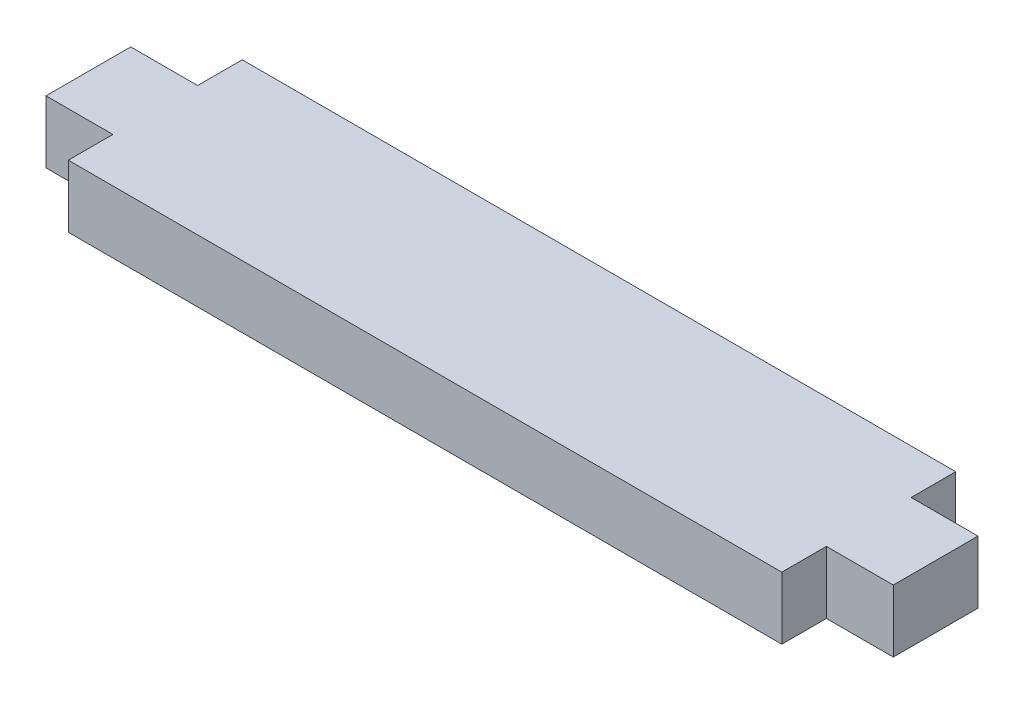
ISO-10303-21;
HEADER;
FILE_DESCRIPTION(('STEP AP214'),'2;1');
FILE_NAME('part.step','',(''),(''),'','','');
FILE_SCHEMA(('AUTOMOTIVE_DESIGN { 1 0 10303 214 1 1 1 1 }'));
ENDSEC;
DATA;
#1=APPLICATION_CONTEXT('core data for automotive mechanical design processes');
#2=APPLICATION_PROTOCOL_DEFINITION('international standard','automotive_design',2000,#1);
#3=PRODUCT_CONTEXT('',#1,'mechanical');
#4=PRODUCT('Part','Part','',(#3));
#5=PRODUCT_RELATED_PRODUCT_CATEGORY('part','',(#4));
#6=PRODUCT_DEFINITION_FORMATION('','',#4);
#7=PRODUCT_DEFINITION_CONTEXT('part definition',#1,'design');
#8=PRODUCT_DEFINITION('design','',#6,#7);
#9=PRODUCT_DEFINITION_SHAPE('','',#8);
#10=(LENGTH_UNIT() NAMED_UNIT(*) SI_UNIT(.MILLI.,.METRE.));
#11=(NAMED_UNIT(*) PLANE_ANGLE_UNIT() SI_UNIT($,.RADIAN.));
#12=(NAMED_UNIT(*) SI_UNIT($,.STERADIAN.) SOLID_ANGLE_UNIT());
#13=UNCERTAINTY_MEASURE_WITH_UNIT(LENGTH_MEASURE(1.E-05),#10,'distance_accuracy_value','');
#14=(GEOMETRIC_REPRESENTATION_CONTEXT(3) GLOBAL_UNCERTAINTY_ASSIGNED_CONTEXT((#13)) GLOBAL_UNIT_ASSIGNED_CONTEXT((#10,
#11,#12)) REPRESENTATION_CONTEXT('',''));
#15=CARTESIAN_POINT('',(0.,0.,0.));
#16=DIRECTION('',(0.,0.,1.));
#17=DIRECTION('',(1.,0.,0.));
#18=AXIS2_PLACEMENT_3D('',#15,#16,#17);
#19=CARTESIAN_POINT('',(80.,0.,19.5));
#20=DIRECTION('',(-1.,0.,0.));
#21=DIRECTION('',(0.,0.,1.));
#22=AXIS2_PLACEMENT_3D('',#19,#20,#21);
#23=PLANE('',#22);
#24=DIRECTION('',(0.,1.,0.));
#25=VECTOR('',#24,1.);
#26=CARTESIAN_POINT('',(80.,-7.,5.));
#27=LINE('',#26,#25);
#28=CARTESIAN_POINT('',(80.,-7.,5.));
#29=VERTEX_POINT('',#28);
#30=CARTESIAN_POINT('',(80.,0.,5.));
#31=VERTEX_POINT('',#30);
#32=EDGE_CURVE('E132',#29,#31,#27,.T.);
#33=ORIENTED_EDGE('',*,*,#32,.F.);
#34=DIRECTION('',(0.,0.,-1.));
#35=VECTOR('',#34,1.);
#36=CARTESIAN_POINT('',(80.,-7.,19.5));
#37=LINE('',#36,#35);
#38=CARTESIAN_POINT('',(80.,-7.,0.));
#39=VERTEX_POINT('',#38);
#40=EDGE_CURVE('E146',#29,#39,#37,.T.);
#41=ORIENTED_EDGE('',*,*,#40,.T.);
#42=DIRECTION('',(0.,1.,0.));
#43=VECTOR('',#42,1.);
#44=CARTESIAN_POINT('',(80.,0.,0.));
#45=LINE('',#44,#43);
#46=CARTESIAN_POINT('',(80.,0.,0.));
#47=VERTEX_POINT('',#46);
#48=EDGE_CURVE('E176',#39,#47,#45,.T.);
#49=ORIENTED_EDGE('',*,*,#48,.T.);
#50=DIRECTION('',(0.,0.,-1.));
#51=VECTOR('',#50,1.);
#52=CARTESIAN_POINT('',(80.,0.,19.5));
#53=LINE('',#52,#51);
#54=EDGE_CURVE('E148',#31,#47,#53,.T.);
#55=ORIENTED_EDGE('',*,*,#54,.F.);
#56=EDGE_LOOP('',(#33,#41,#49,#55));
#57=FACE_BOUND('',#56,.T.);
#58=ADVANCED_FACE('F39',(#57),#23,.F.);
#59=CARTESIAN_POINT('',(0.,0.,19.5));
#60=DIRECTION('',(1.,0.,0.));
#61=DIRECTION('',(0.,1.,0.));
#62=AXIS2_PLACEMENT_3D('',#59,#60,#61);
#63=PLANE('',#62);
#64=DIRECTION('',(0.,1.,0.));
#65=VECTOR('',#64,1.);
#66=CARTESIAN_POINT('',(0.,-7.,14.5));
#67=LINE('',#66,#65);
#68=CARTESIAN_POINT('',(0.,-7.,14.5));
#69=VERTEX_POINT('',#68);
#70=CARTESIAN_POINT('',(0.,0.,14.5));
#71=VERTEX_POINT('',#70);
#72=EDGE_CURVE('E185',#69,#71,#67,.T.);
#73=ORIENTED_EDGE('',*,*,#72,.F.);
#74=DIRECTION('',(0.,0.,-1.));
#75=VECTOR('',#74,1.);
#76=CARTESIAN_POINT('',(0.,-7.,19.5));
#77=LINE('',#76,#75);
#78=CARTESIAN_POINT('',(0.,-7.,19.5));
#79=VERTEX_POINT('',#78);
#80=EDGE_CURVE('E11',#79,#69,#77,.T.);
#81=ORIENTED_EDGE('',*,*,#80,.F.);
#82=DIRECTION('',(0.,-1.,0.));
#83=VECTOR('',#82,1.);
#84=CARTESIAN_POINT('',(0.,0.,19.5));
#85=LINE('',#84,#83);
#86=CARTESIAN_POINT('',(0.,0.,19.5));
#87=VERTEX_POINT('',#86);
#88=EDGE_CURVE('E175',#87,#79,#85,.T.);
#89=ORIENTED_EDGE('',*,*,#88,.F.);
#90=DIRECTION('',(0.,0.,-1.));
#91=VECTOR('',#90,1.);
#92=CARTESIAN_POINT('',(0.,0.,19.5));
#93=LINE('',#92,#91);
#94=EDGE_CURVE('E166',#87,#71,#93,.T.);
#95=ORIENTED_EDGE('',*,*,#94,.T.);
#96=EDGE_LOOP('',(#73,#81,#89,#95));
#97=FACE_BOUND('',#96,.T.);
#98=ADVANCED_FACE('F270',(#97),#63,.F.);
#99=CARTESIAN_POINT('',(0.,-7.,5.));
#100=VERTEX_POINT('',#99);
#101=CARTESIAN_POINT('',(0.,-7.,0.));
#102=VERTEX_POINT('',#101);
#103=EDGE_CURVE('E48',#100,#102,#77,.T.);
#104=ORIENTED_EDGE('',*,*,#103,.F.);
#105=DIRECTION('',(0.,1.,0.));
#106=VECTOR('',#105,1.);
#107=CARTESIAN_POINT('',(0.,-7.,5.));
#108=LINE('',#107,#106);
#109=CARTESIAN_POINT('',(0.,0.,5.));
#110=VERTEX_POINT('',#109);
#111=EDGE_CURVE('E198',#100,#110,#108,.T.);
#112=ORIENTED_EDGE('',*,*,#111,.T.);
#113=CARTESIAN_POINT('',(0.,0.,0.));
#114=VERTEX_POINT('',#113);
#115=EDGE_CURVE('E170',#110,#114,#93,.T.);
#116=ORIENTED_EDGE('',*,*,#115,.T.);
#117=DIRECTION('',(0.,-1.,0.));
#118=VECTOR('',#117,1.);
#119=CARTESIAN_POINT('',(0.,0.,0.));
#120=LINE('',#119,#118);
#121=EDGE_CURVE('E181',#114,#102,#120,.T.);
#122=ORIENTED_EDGE('',*,*,#121,.T.);
#123=EDGE_LOOP('',(#104,#112,#116,#122));
#124=FACE_BOUND('',#123,.T.);
#125=ADVANCED_FACE('F41',(#124),#63,.F.);
#126=CARTESIAN_POINT('',(0.,-7.,19.5));
#127=DIRECTION('',(0.,1.,0.));
#128=DIRECTION('',(0.,0.,1.));
#129=AXIS2_PLACEMENT_3D('',#126,#127,#128);
#130=PLANE('',#129);
#131=DIRECTION('',(1.,0.,0.));
#132=VECTOR('',#131,1.);
#133=CARTESIAN_POINT('',(0.,-7.,0.));
#134=LINE('',#133,#132);
#135=EDGE_CURVE('E155',#102,#39,#134,.T.);
#136=ORIENTED_EDGE('',*,*,#135,.T.);
#137=ORIENTED_EDGE('',*,*,#40,.F.);
#138=DIRECTION('',(-1.,0.,0.));
#139=VECTOR('',#138,1.);
#140=CARTESIAN_POINT('',(80.,-7.,5.));
#141=LINE('',#140,#139);
#142=CARTESIAN_POINT('',(87.5,-7.,5.));
#143=VERTEX_POINT('',#142);
#144=EDGE_CURVE('E128',#143,#29,#141,.T.);
#145=ORIENTED_EDGE('',*,*,#144,.F.);
#146=DIRECTION('',(0.,0.,-1.));
#147=VECTOR('',#146,1.);
#148=CARTESIAN_POINT('',(87.5,-7.,5.));
#149=LINE('',#148,#147);
#150=CARTESIAN_POINT('',(87.5,-7.,14.5));
#151=VERTEX_POINT('',#150);
#152=EDGE_CURVE('E151',#151,#143,#149,.T.);
#153=ORIENTED_EDGE('',*,*,#152,.F.);
#154=DIRECTION('',(1.,0.,0.));
#155=VECTOR('',#154,1.);
#156=CARTESIAN_POINT('',(80.,-7.,14.5));
#157=LINE('',#156,#155);
#158=CARTESIAN_POINT('',(80.,-7.,14.5));
#159=VERTEX_POINT('',#158);
#160=EDGE_CURVE('E140',#159,#151,#157,.T.);
#161=ORIENTED_EDGE('',*,*,#160,.F.);
#162=CARTESIAN_POINT('',(80.,-7.,19.5));
#163=VERTEX_POINT('',#162);
#164=EDGE_CURVE('E158',#163,#159,#37,.T.);
#165=ORIENTED_EDGE('',*,*,#164,.F.);
#166=DIRECTION('',(1.,0.,0.));
#167=VECTOR('',#166,1.);
#168=CARTESIAN_POINT('',(0.,-7.,19.5));
#169=LINE('',#168,#167);
#170=EDGE_CURVE('E192',#79,#163,#169,.T.);
#171=ORIENTED_EDGE('',*,*,#170,.F.);
#172=ORIENTED_EDGE('',*,*,#80,.T.);
#173=DIRECTION('',(1.,0.,0.));
#174=VECTOR('',#173,1.);
#175=CARTESIAN_POINT('',(0.,-7.,14.5));
#176=LINE('',#175,#174);
#177=CARTESIAN_POINT('',(-7.5,-7.,14.5));
#178=VERTEX_POINT('',#177);
#179=EDGE_CURVE('E202',#178,#69,#176,.T.);
#180=ORIENTED_EDGE('',*,*,#179,.F.);
#181=DIRECTION('',(0.,0.,1.));
#182=VECTOR('',#181,1.);
#183=CARTESIAN_POINT('',(-7.5,-7.,5.));
#184=LINE('',#183,#182);
#185=CARTESIAN_POINT('',(-7.5,-7.,5.));
#186=VERTEX_POINT('',#185);
#187=EDGE_CURVE('E223',#186,#178,#184,.T.);
#188=ORIENTED_EDGE('',*,*,#187,.F.);
#189=DIRECTION('',(-1.,0.,0.));
#190=VECTOR('',#189,1.);
#191=CARTESIAN_POINT('',(0.,-7.,5.));
#192=LINE('',#191,#190);
#193=EDGE_CURVE('E214',#100,#186,#192,.T.);
#194=ORIENTED_EDGE('',*,*,#193,.F.);
#195=ORIENTED_EDGE('',*,*,#103,.T.);
#196=EDGE_LOOP('',(#136,#137,#145,#153,#161,#165,#171,#172,#180,#188,#194,#195));
#197=FACE_BOUND('',#196,.T.);
#198=ADVANCED_FACE('F153',(#197),#130,.F.);
#199=ORIENTED_EDGE('',*,*,#164,.T.);
#200=DIRECTION('',(0.,1.,0.));
#201=VECTOR('',#200,1.);
#202=CARTESIAN_POINT('',(80.,-7.,14.5));
#203=LINE('',#202,#201);
#204=CARTESIAN_POINT('',(80.,0.,14.5));
#205=VERTEX_POINT('',#204);
#206=EDGE_CURVE('E150',#159,#205,#203,.T.);
#207=ORIENTED_EDGE('',*,*,#206,.T.);
#208=CARTESIAN_POINT('',(80.,0.,19.5));
#209=VERTEX_POINT('',#208);
#210=EDGE_CURVE('E159',#209,#205,#53,.T.);
#211=ORIENTED_EDGE('',*,*,#210,.F.);
#212=DIRECTION('',(0.,1.,0.));
#213=VECTOR('',#212,1.);
#214=CARTESIAN_POINT('',(80.,0.,19.5));
#215=LINE('',#214,#213);
#216=EDGE_CURVE('E189',#163,#209,#215,.T.);
#217=ORIENTED_EDGE('',*,*,#216,.F.);
#218=EDGE_LOOP('',(#199,#207,#211,#217));
#219=FACE_BOUND('',#218,.T.);
#220=ADVANCED_FACE('F262',(#219),#23,.F.);
#221=CARTESIAN_POINT('',(0.,0.,19.5));
#222=DIRECTION('',(0.,-1.,0.));
#223=DIRECTION('',(0.,0.,-1.));
#224=AXIS2_PLACEMENT_3D('',#221,#222,#223);
#225=PLANE('',#224);
#226=DIRECTION('',(-1.,0.,0.));
#227=VECTOR('',#226,1.);
#228=CARTESIAN_POINT('',(0.,0.,0.));
#229=LINE('',#228,#227);
#230=EDGE_CURVE('E171',#47,#114,#229,.T.);
#231=ORIENTED_EDGE('',*,*,#230,.T.);
#232=ORIENTED_EDGE('',*,*,#115,.F.);
#233=DIRECTION('',(-1.,0.,0.));
#234=VECTOR('',#233,1.);
#235=CARTESIAN_POINT('',(0.,0.,5.));
#236=LINE('',#235,#234);
#237=CARTESIAN_POINT('',(-7.5,0.,5.));
#238=VERTEX_POINT('',#237);
#239=EDGE_CURVE('E63',#110,#238,#236,.T.);
#240=ORIENTED_EDGE('',*,*,#239,.T.);
#241=DIRECTION('',(0.,0.,1.));
#242=VECTOR('',#241,1.);
#243=CARTESIAN_POINT('',(-7.5,0.,5.));
#244=LINE('',#243,#242);
#245=CARTESIAN_POINT('',(-7.5,0.,14.5));
#246=VERTEX_POINT('',#245);
#247=EDGE_CURVE('E215',#238,#246,#244,.T.);
#248=ORIENTED_EDGE('',*,*,#247,.T.);
#249=DIRECTION('',(1.,0.,0.));
#250=VECTOR('',#249,1.);
#251=CARTESIAN_POINT('',(0.,0.,14.5));
#252=LINE('',#251,#250);
#253=EDGE_CURVE('E210',#246,#71,#252,.T.);
#254=ORIENTED_EDGE('',*,*,#253,.T.);
#255=ORIENTED_EDGE('',*,*,#94,.F.);
#256=DIRECTION('',(-1.,0.,0.));
#257=VECTOR('',#256,1.);
#258=CARTESIAN_POINT('',(0.,0.,19.5));
#259=LINE('',#258,#257);
#260=EDGE_CURVE('E186',#209,#87,#259,.T.);
#261=ORIENTED_EDGE('',*,*,#260,.F.);
#262=ORIENTED_EDGE('',*,*,#210,.T.);
#263=DIRECTION('',(1.,0.,0.));
#264=VECTOR('',#263,1.);
#265=CARTESIAN_POINT('',(80.,0.,14.5));
#266=LINE('',#265,#264);
#267=CARTESIAN_POINT('',(87.5,0.,14.5));
#268=VERTEX_POINT('',#267);
#269=EDGE_CURVE('E55',#205,#268,#266,.T.);
#270=ORIENTED_EDGE('',*,*,#269,.T.);
#271=DIRECTION('',(0.,0.,-1.));
#272=VECTOR('',#271,1.);
#273=CARTESIAN_POINT('',(87.5,0.,5.));
#274=LINE('',#273,#272);
#275=CARTESIAN_POINT('',(87.5,0.,5.));
#276=VERTEX_POINT('',#275);
#277=EDGE_CURVE('E141',#268,#276,#274,.T.);
#278=ORIENTED_EDGE('',*,*,#277,.T.);
#279=DIRECTION('',(-1.,0.,0.));
#280=VECTOR('',#279,1.);
#281=CARTESIAN_POINT('',(80.,0.,5.));
#282=LINE('',#281,#280);
#283=EDGE_CURVE('E242',#276,#31,#282,.T.);
#284=ORIENTED_EDGE('',*,*,#283,.T.);
#285=ORIENTED_EDGE('',*,*,#54,.T.);
#286=EDGE_LOOP('',(#231,#232,#240,#248,#254,#255,#261,#262,#270,#278,#284,#285));
#287=FACE_BOUND('',#286,.T.);
#288=ADVANCED_FACE('F256',(#287),#225,.F.);
#289=CARTESIAN_POINT('',(0.,0.,19.5));
#290=DIRECTION('',(0.,0.,1.));
#291=DIRECTION('',(1.,0.,0.));
#292=AXIS2_PLACEMENT_3D('',#289,#290,#291);
#293=PLANE('',#292);
#294=ORIENTED_EDGE('',*,*,#88,.T.);
#295=ORIENTED_EDGE('',*,*,#170,.T.);
#296=ORIENTED_EDGE('',*,*,#216,.T.);
#297=ORIENTED_EDGE('',*,*,#260,.T.);
#298=EDGE_LOOP('',(#294,#295,#296,#297));
#299=FACE_BOUND('',#298,.T.);
#300=ADVANCED_FACE('F267',(#299),#293,.T.);
#301=CARTESIAN_POINT('',(0.,0.,0.));
#302=DIRECTION('',(0.,0.,1.));
#303=DIRECTION('',(1.,0.,0.));
#304=AXIS2_PLACEMENT_3D('',#301,#302,#303);
#305=PLANE('',#304);
#306=ORIENTED_EDGE('',*,*,#121,.F.);
#307=ORIENTED_EDGE('',*,*,#230,.F.);
#308=ORIENTED_EDGE('',*,*,#48,.F.);
#309=ORIENTED_EDGE('',*,*,#135,.F.);
#310=EDGE_LOOP('',(#306,#307,#308,#309));
#311=FACE_BOUND('',#310,.T.);
#312=ADVANCED_FACE('F288',(#311),#305,.F.);
#313=CARTESIAN_POINT('',(0.,-7.,14.5));
#314=DIRECTION('',(0.,0.,1.));
#315=DIRECTION('',(1.,0.,0.));
#316=AXIS2_PLACEMENT_3D('',#313,#314,#315);
#317=PLANE('',#316);
#318=ORIENTED_EDGE('',*,*,#253,.F.);
#319=DIRECTION('',(0.,1.,0.));
#320=VECTOR('',#319,1.);
#321=CARTESIAN_POINT('',(-7.5,-7.,14.5));
#322=LINE('',#321,#320);
#323=EDGE_CURVE('E205',#178,#246,#322,.T.);
#324=ORIENTED_EDGE('',*,*,#323,.F.);
#325=ORIENTED_EDGE('',*,*,#179,.T.);
#326=ORIENTED_EDGE('',*,*,#72,.T.);
#327=EDGE_LOOP('',(#318,#324,#325,#326));
#328=FACE_BOUND('',#327,.T.);
#329=ADVANCED_FACE('F273',(#328),#317,.T.);
#330=CARTESIAN_POINT('',(-7.5,-7.,5.));
#331=DIRECTION('',(-1.,0.,0.));
#332=DIRECTION('',(0.,0.,1.));
#333=AXIS2_PLACEMENT_3D('',#330,#331,#332);
#334=PLANE('',#333);
#335=ORIENTED_EDGE('',*,*,#247,.F.);
#336=DIRECTION('',(0.,1.,0.));
#337=VECTOR('',#336,1.);
#338=CARTESIAN_POINT('',(-7.5,-7.,5.));
#339=LINE('',#338,#337);
#340=EDGE_CURVE('E201',#186,#238,#339,.T.);
#341=ORIENTED_EDGE('',*,*,#340,.F.);
#342=ORIENTED_EDGE('',*,*,#187,.T.);
#343=ORIENTED_EDGE('',*,*,#323,.T.);
#344=EDGE_LOOP('',(#335,#341,#342,#343));
#345=FACE_BOUND('',#344,.T.);
#346=ADVANCED_FACE('F277',(#345),#334,.T.);
#347=CARTESIAN_POINT('',(0.,-7.,5.));
#348=DIRECTION('',(0.,0.,-1.));
#349=DIRECTION('',(-1.,0.,0.));
#350=AXIS2_PLACEMENT_3D('',#347,#348,#349);
#351=PLANE('',#350);
#352=ORIENTED_EDGE('',*,*,#239,.F.);
#353=ORIENTED_EDGE('',*,*,#111,.F.);
#354=ORIENTED_EDGE('',*,*,#193,.T.);
#355=ORIENTED_EDGE('',*,*,#340,.T.);
#356=EDGE_LOOP('',(#352,#353,#354,#355));
#357=FACE_BOUND('',#356,.T.);
#358=ADVANCED_FACE('F281',(#357),#351,.T.);
#359=CARTESIAN_POINT('',(80.,-7.,5.));
#360=DIRECTION('',(0.,0.,-1.));
#361=DIRECTION('',(-1.,0.,0.));
#362=AXIS2_PLACEMENT_3D('',#359,#360,#361);
#363=PLANE('',#362);
#364=ORIENTED_EDGE('',*,*,#283,.F.);
#365=DIRECTION('',(0.,1.,0.));
#366=VECTOR('',#365,1.);
#367=CARTESIAN_POINT('',(87.5,-7.,5.));
#368=LINE('',#367,#366);
#369=EDGE_CURVE('E134',#143,#276,#368,.T.);
#370=ORIENTED_EDGE('',*,*,#369,.F.);
#371=ORIENTED_EDGE('',*,*,#144,.T.);
#372=ORIENTED_EDGE('',*,*,#32,.T.);
#373=EDGE_LOOP('',(#364,#370,#371,#372));
#374=FACE_BOUND('',#373,.T.);
#375=ADVANCED_FACE('F131',(#374),#363,.T.);
#376=CARTESIAN_POINT('',(87.5,-7.,5.));
#377=DIRECTION('',(1.,0.,0.));
#378=DIRECTION('',(0.,0.,-1.));
#379=AXIS2_PLACEMENT_3D('',#376,#377,#378);
#380=PLANE('',#379);
#381=ORIENTED_EDGE('',*,*,#277,.F.);
#382=DIRECTION('',(0.,1.,0.));
#383=VECTOR('',#382,1.);
#384=CARTESIAN_POINT('',(87.5,-7.,14.5));
#385=LINE('',#384,#383);
#386=EDGE_CURVE('E232',#151,#268,#385,.T.);
#387=ORIENTED_EDGE('',*,*,#386,.F.);
#388=ORIENTED_EDGE('',*,*,#152,.T.);
#389=ORIENTED_EDGE('',*,*,#369,.T.);
#390=EDGE_LOOP('',(#381,#387,#388,#389));
#391=FACE_BOUND('',#390,.T.);
#392=ADVANCED_FACE('F254',(#391),#380,.T.);
#393=CARTESIAN_POINT('',(80.,-7.,14.5));
#394=DIRECTION('',(0.,0.,1.));
#395=DIRECTION('',(1.,0.,0.));
#396=AXIS2_PLACEMENT_3D('',#393,#394,#395);
#397=PLANE('',#396);
#398=ORIENTED_EDGE('',*,*,#269,.F.);
#399=ORIENTED_EDGE('',*,*,#206,.F.);
#400=ORIENTED_EDGE('',*,*,#160,.T.);
#401=ORIENTED_EDGE('',*,*,#386,.T.);
#402=EDGE_LOOP('',(#398,#399,#400,#401));
#403=FACE_BOUND('',#402,.T.);
#404=ADVANCED_FACE('F250',(#403),#397,.T.);
#405=CLOSED_SHELL('',(#58,#98,#125,#198,#220,#288,#300,#312,#329,#346,#358,#375,#392,#404));
#406=MANIFOLD_SOLID_BREP('B2',#405);
#407=ADVANCED_BREP_SHAPE_REPRESENTATION('',(#18,#406),#14);
#408=SHAPE_DEFINITION_REPRESENTATION(#9,#407);
ENDSEC;
END-ISO-10303-21;
